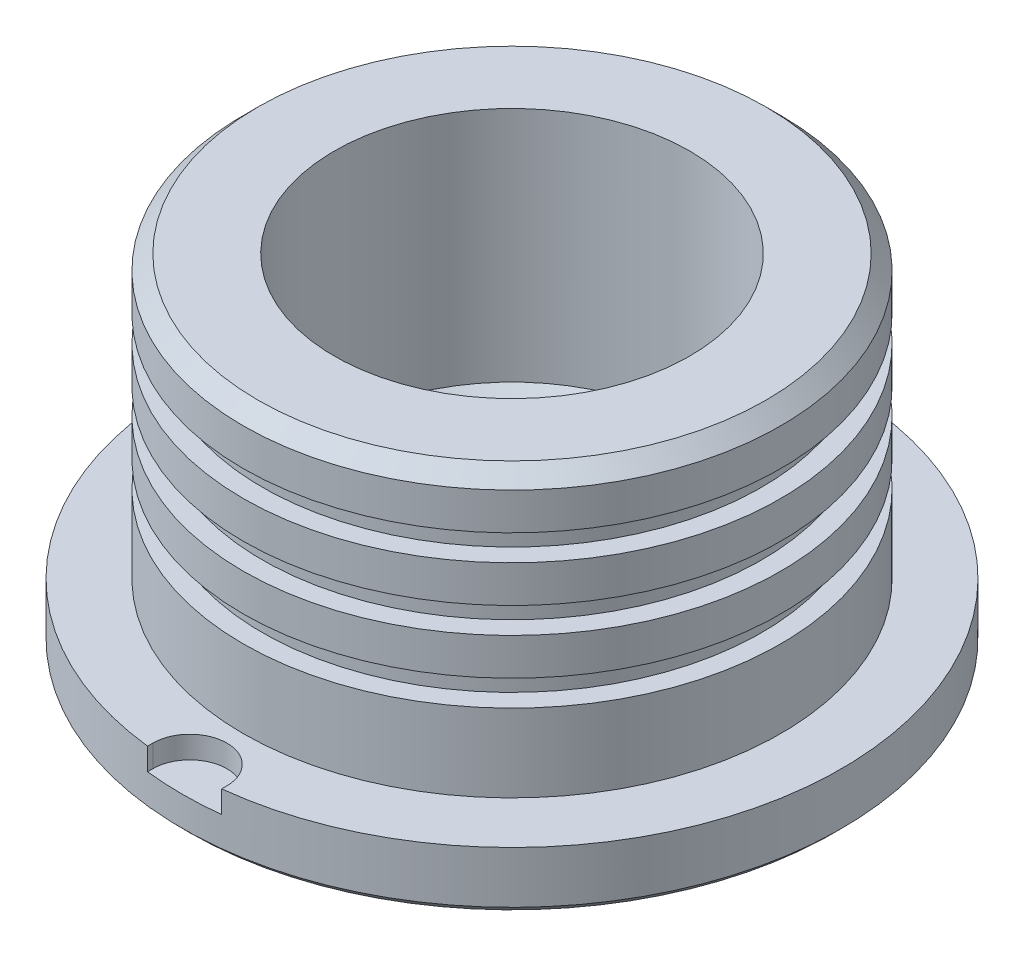
ISO-10303-21;
HEADER;
FILE_DESCRIPTION(('STEP AP214'),'2;1');
FILE_NAME('part.step','',(''),(''),'','','');
FILE_SCHEMA(('AUTOMOTIVE_DESIGN { 1 0 10303 214 1 1 1 1 }'));
ENDSEC;
DATA;
#1=APPLICATION_CONTEXT('core data for automotive mechanical design processes');
#2=APPLICATION_PROTOCOL_DEFINITION('international standard','automotive_design',2000,#1);
#3=PRODUCT_CONTEXT('',#1,'mechanical');
#4=PRODUCT('Part','Part','',(#3));
#5=PRODUCT_RELATED_PRODUCT_CATEGORY('part','',(#4));
#6=PRODUCT_DEFINITION_FORMATION('','',#4);
#7=PRODUCT_DEFINITION_CONTEXT('part definition',#1,'design');
#8=PRODUCT_DEFINITION('design','',#6,#7);
#9=PRODUCT_DEFINITION_SHAPE('','',#8);
#10=(LENGTH_UNIT() NAMED_UNIT(*) SI_UNIT(.MILLI.,.METRE.));
#11=(NAMED_UNIT(*) PLANE_ANGLE_UNIT() SI_UNIT($,.RADIAN.));
#12=(NAMED_UNIT(*) SI_UNIT($,.STERADIAN.) SOLID_ANGLE_UNIT());
#13=UNCERTAINTY_MEASURE_WITH_UNIT(LENGTH_MEASURE(1.E-05),#10,'distance_accuracy_value','');
#14=(GEOMETRIC_REPRESENTATION_CONTEXT(3) GLOBAL_UNCERTAINTY_ASSIGNED_CONTEXT((#13)) GLOBAL_UNIT_ASSIGNED_CONTEXT((#10,
#11,#12)) REPRESENTATION_CONTEXT('',''));
#15=CARTESIAN_POINT('',(0.,0.,0.));
#16=DIRECTION('',(0.,0.,1.));
#17=DIRECTION('',(1.,0.,0.));
#18=AXIS2_PLACEMENT_3D('',#15,#16,#17);
#19=CARTESIAN_POINT('',(24.,12.0000000000002,0.));
#20=DIRECTION('',(0.,1.,0.));
#21=DIRECTION('',(0.,0.,1.));
#22=AXIS2_PLACEMENT_3D('',#19,#20,#21);
#23=PLANE('',#22);
#24=CARTESIAN_POINT('',(0.,12.0000000000002,0.));
#25=DIRECTION('',(0.,1.,0.));
#26=DIRECTION('',(0.,0.,1.));
#27=AXIS2_PLACEMENT_3D('',#24,#25,#26);
#28=CIRCLE('',#27,22.);
#29=CARTESIAN_POINT('',(0.,12.0000000000002,22.));
#30=VERTEX_POINT('',#29);
#31=EDGE_CURVE('E226',#30,#30,#28,.T.);
#32=ORIENTED_EDGE('',*,*,#31,.T.);
#33=EDGE_LOOP('',(#32));
#34=FACE_BOUND('',#33,.T.);
#35=CARTESIAN_POINT('',(-9.94112549695428,12.0000000000002,9.94112549695428));
#36=DIRECTION('',(0.,1.,0.));
#37=DIRECTION('',(0.,0.,1.));
#38=AXIS2_PLACEMENT_3D('',#35,#36,#37);
#39=CIRCLE('',#38,5.);
#40=CARTESIAN_POINT('',(-9.94112549695428,12.0000000000002,14.9411254969543));
#41=VERTEX_POINT('',#40);
#42=EDGE_CURVE('E417',#41,#41,#39,.F.);
#43=ORIENTED_EDGE('',*,*,#42,.T.);
#44=EDGE_LOOP('',(#43));
#45=FACE_BOUND('',#44,.T.);
#46=CARTESIAN_POINT('',(9.94112549695428,12.0000000000002,9.94112549695428));
#47=DIRECTION('',(0.,1.,0.));
#48=DIRECTION('',(0.,0.,1.));
#49=AXIS2_PLACEMENT_3D('',#46,#47,#48);
#50=CIRCLE('',#49,5.);
#51=CARTESIAN_POINT('',(9.94112549695428,12.0000000000002,14.9411254969543));
#52=VERTEX_POINT('',#51);
#53=EDGE_CURVE('E414',#52,#52,#50,.T.);
#54=ORIENTED_EDGE('',*,*,#53,.F.);
#55=EDGE_LOOP('',(#54));
#56=FACE_BOUND('',#55,.T.);
#57=CARTESIAN_POINT('',(-9.94112549695428,12.0000000000002,-9.94112549695428));
#58=DIRECTION('',(0.,1.,0.));
#59=DIRECTION('',(0.,0.,1.));
#60=AXIS2_PLACEMENT_3D('',#57,#58,#59);
#61=CIRCLE('',#60,5.);
#62=CARTESIAN_POINT('',(-9.94112549695428,12.0000000000002,-4.94112549695428));
#63=VERTEX_POINT('',#62);
#64=EDGE_CURVE('E134',#63,#63,#61,.T.);
#65=ORIENTED_EDGE('',*,*,#64,.F.);
#66=EDGE_LOOP('',(#65));
#67=FACE_BOUND('',#66,.T.);
#68=CARTESIAN_POINT('',(9.94112549695428,12.0000000000002,-9.94112549695428));
#69=DIRECTION('',(0.,1.,0.));
#70=DIRECTION('',(0.,0.,1.));
#71=AXIS2_PLACEMENT_3D('',#68,#69,#70);
#72=CIRCLE('',#71,5.);
#73=CARTESIAN_POINT('',(9.94112549695428,12.0000000000002,-4.94112549695428));
#74=VERTEX_POINT('',#73);
#75=EDGE_CURVE('E423',#74,#74,#72,.F.);
#76=ORIENTED_EDGE('',*,*,#75,.T.);
#77=EDGE_LOOP('',(#76));
#78=FACE_BOUND('',#77,.T.);
#79=ADVANCED_FACE('F43',(#34,#45,#56,#67,#78),#23,.T.);
#80=CARTESIAN_POINT('',(0.,0.,0.));
#81=DIRECTION('',(0.,-1.,0.));
#82=DIRECTION('',(0.,0.,-1.));
#83=AXIS2_PLACEMENT_3D('',#80,#81,#82);
#84=PLANE('',#83);
#85=CARTESIAN_POINT('',(0.,0.,0.));
#86=DIRECTION('',(0.,-1.,0.));
#87=DIRECTION('',(0.,0.,-1.));
#88=AXIS2_PLACEMENT_3D('',#85,#86,#87);
#89=CIRCLE('',#88,43.5);
#90=CARTESIAN_POINT('',(0.,0.,-43.5));
#91=VERTEX_POINT('',#90);
#92=EDGE_CURVE('E52',#91,#91,#89,.T.);
#93=ORIENTED_EDGE('',*,*,#92,.T.);
#94=EDGE_LOOP('',(#93));
#95=FACE_BOUND('',#94,.T.);
#96=CARTESIAN_POINT('',(-9.94112549695428,0.,9.94112549695428));
#97=DIRECTION('',(0.,1.,0.));
#98=DIRECTION('',(0.,0.,1.));
#99=AXIS2_PLACEMENT_3D('',#96,#97,#98);
#100=CIRCLE('',#99,5.);
#101=CARTESIAN_POINT('',(-9.94112549695428,0.,14.9411254969543));
#102=VERTEX_POINT('',#101);
#103=EDGE_CURVE('E426',#102,#102,#100,.F.);
#104=ORIENTED_EDGE('',*,*,#103,.F.);
#105=EDGE_LOOP('',(#104));
#106=FACE_BOUND('',#105,.T.);
#107=CARTESIAN_POINT('',(9.94112549695428,0.,9.94112549695428));
#108=DIRECTION('',(0.,1.,0.));
#109=DIRECTION('',(0.,0.,1.));
#110=AXIS2_PLACEMENT_3D('',#107,#108,#109);
#111=CIRCLE('',#110,5.);
#112=CARTESIAN_POINT('',(9.94112549695428,0.,14.9411254969543));
#113=VERTEX_POINT('',#112);
#114=EDGE_CURVE('E411',#113,#113,#111,.T.);
#115=ORIENTED_EDGE('',*,*,#114,.T.);
#116=EDGE_LOOP('',(#115));
#117=FACE_BOUND('',#116,.T.);
#118=CARTESIAN_POINT('',(-9.94112549695428,0.,-9.94112549695428));
#119=DIRECTION('',(0.,1.,0.));
#120=DIRECTION('',(0.,0.,1.));
#121=AXIS2_PLACEMENT_3D('',#118,#119,#120);
#122=CIRCLE('',#121,5.);
#123=CARTESIAN_POINT('',(-9.94112549695428,0.,-4.94112549695428));
#124=VERTEX_POINT('',#123);
#125=EDGE_CURVE('E153',#124,#124,#122,.T.);
#126=ORIENTED_EDGE('',*,*,#125,.T.);
#127=EDGE_LOOP('',(#126));
#128=FACE_BOUND('',#127,.T.);
#129=CARTESIAN_POINT('',(9.94112549695428,0.,-9.94112549695428));
#130=DIRECTION('',(0.,1.,0.));
#131=DIRECTION('',(0.,0.,1.));
#132=AXIS2_PLACEMENT_3D('',#129,#130,#131);
#133=CIRCLE('',#132,5.);
#134=CARTESIAN_POINT('',(9.94112549695428,0.,-4.94112549695428));
#135=VERTEX_POINT('',#134);
#136=EDGE_CURVE('E420',#135,#135,#133,.F.);
#137=ORIENTED_EDGE('',*,*,#136,.F.);
#138=EDGE_LOOP('',(#137));
#139=FACE_BOUND('',#138,.T.);
#140=ADVANCED_FACE('F231',(#95,#106,#117,#128,#139),#84,.T.);
#141=CARTESIAN_POINT('',(0.,0.,0.));
#142=DIRECTION('',(0.,-1.,0.));
#143=DIRECTION('',(0.,0.,-1.));
#144=AXIS2_PLACEMENT_3D('',#141,#142,#143);
#145=CYLINDRICAL_SURFACE('',#144,36.3);
#146=CARTESIAN_POINT('',(0.,44.,0.));
#147=DIRECTION('',(0.,1.,0.));
#148=DIRECTION('',(0.,0.,1.));
#149=AXIS2_PLACEMENT_3D('',#146,#147,#148);
#150=CIRCLE('',#149,36.3);
#151=CARTESIAN_POINT('',(0.,44.,36.3));
#152=VERTEX_POINT('',#151);
#153=EDGE_CURVE('E217',#152,#152,#150,.F.);
#154=ORIENTED_EDGE('',*,*,#153,.T.);
#155=EDGE_LOOP('',(#154));
#156=FACE_BOUND('',#155,.T.);
#157=CARTESIAN_POINT('',(0.,39.,0.));
#158=DIRECTION('',(0.,-1.,0.));
#159=DIRECTION('',(0.,0.,-1.));
#160=AXIS2_PLACEMENT_3D('',#157,#158,#159);
#161=CIRCLE('',#160,36.3);
#162=CARTESIAN_POINT('',(0.,39.,-36.3));
#163=VERTEX_POINT('',#162);
#164=EDGE_CURVE('E163',#163,#163,#161,.T.);
#165=ORIENTED_EDGE('',*,*,#164,.F.);
#166=EDGE_LOOP('',(#165));
#167=FACE_BOUND('',#166,.T.);
#168=ADVANCED_FACE('F249',(#156,#167),#145,.T.);
#169=CARTESIAN_POINT('',(36.3,46.,0.));
#170=DIRECTION('',(0.,1.,0.));
#171=DIRECTION('',(0.,0.,1.));
#172=AXIS2_PLACEMENT_3D('',#169,#170,#171);
#173=PLANE('',#172);
#174=CARTESIAN_POINT('',(0.,46.,0.));
#175=DIRECTION('',(0.,1.,0.));
#176=DIRECTION('',(0.,0.,1.));
#177=AXIS2_PLACEMENT_3D('',#174,#175,#176);
#178=CIRCLE('',#177,34.2999999999999);
#179=CARTESIAN_POINT('',(0.,46.,34.2999999999999));
#180=VERTEX_POINT('',#179);
#181=EDGE_CURVE('E220',#180,#180,#178,.T.);
#182=ORIENTED_EDGE('',*,*,#181,.T.);
#183=EDGE_LOOP('',(#182));
#184=FACE_BOUND('',#183,.T.);
#185=CARTESIAN_POINT('',(0.,46.,0.));
#186=DIRECTION('',(0.,-1.,0.));
#187=DIRECTION('',(0.,0.,-1.));
#188=AXIS2_PLACEMENT_3D('',#185,#186,#187);
#189=CIRCLE('',#188,24.);
#190=CARTESIAN_POINT('',(0.,46.,-24.));
#191=VERTEX_POINT('',#190);
#192=EDGE_CURVE('E206',#191,#191,#189,.T.);
#193=ORIENTED_EDGE('',*,*,#192,.T.);
#194=EDGE_LOOP('',(#193));
#195=FACE_BOUND('',#194,.T.);
#196=ADVANCED_FACE('F258',(#184,#195),#173,.T.);
#197=CARTESIAN_POINT('',(0.,0.,0.));
#198=DIRECTION('',(0.,-1.,0.));
#199=DIRECTION('',(0.,0.,-1.));
#200=AXIS2_PLACEMENT_3D('',#197,#198,#199);
#201=CYLINDRICAL_SURFACE('',#200,24.);
#202=CARTESIAN_POINT('',(0.,14.0000000000003,0.));
#203=DIRECTION('',(0.,1.,0.));
#204=DIRECTION('',(0.,0.,1.));
#205=AXIS2_PLACEMENT_3D('',#202,#203,#204);
#206=CIRCLE('',#205,24.);
#207=CARTESIAN_POINT('',(0.,14.0000000000003,24.));
#208=VERTEX_POINT('',#207);
#209=EDGE_CURVE('E223',#208,#208,#206,.F.);
#210=ORIENTED_EDGE('',*,*,#209,.T.);
#211=EDGE_LOOP('',(#210));
#212=FACE_BOUND('',#211,.T.);
#213=ORIENTED_EDGE('',*,*,#192,.F.);
#214=EDGE_LOOP('',(#213));
#215=FACE_BOUND('',#214,.T.);
#216=ADVANCED_FACE('F254',(#212,#215),#201,.F.);
#217=CARTESIAN_POINT('',(0.,0.,0.));
#218=DIRECTION('',(0.,-1.,0.));
#219=DIRECTION('',(0.,0.,-1.));
#220=AXIS2_PLACEMENT_3D('',#217,#218,#219);
#221=CYLINDRICAL_SURFACE('',#220,44.5);
#222=CARTESIAN_POINT('',(0.,0.99999999999997,0.));
#223=DIRECTION('',(0.,-1.,0.));
#224=DIRECTION('',(0.,0.,-1.));
#225=AXIS2_PLACEMENT_3D('',#222,#223,#224);
#226=CIRCLE('',#225,44.5);
#227=CARTESIAN_POINT('',(0.,0.99999999999997,-44.5));
#228=VERTEX_POINT('',#227);
#229=EDGE_CURVE('E11',#228,#228,#226,.F.);
#230=ORIENTED_EDGE('',*,*,#229,.T.);
#231=EDGE_LOOP('',(#230));
#232=FACE_BOUND('',#231,.T.);
#233=DIRECTION('',(0.,-1.,0.));
#234=VECTOR('',#233,1.);
#235=CARTESIAN_POINT('',(-5.,0.,-44.218208918951));
#236=LINE('',#235,#234);
#237=CARTESIAN_POINT('',(-5.,5.,-44.218208918951));
#238=VERTEX_POINT('',#237);
#239=CARTESIAN_POINT('',(-5.,8.,-44.218208918951));
#240=VERTEX_POINT('',#239);
#241=EDGE_CURVE('E161',#238,#240,#236,.F.);
#242=ORIENTED_EDGE('',*,*,#241,.F.);
#243=CARTESIAN_POINT('',(0.,5.,0.));
#244=DIRECTION('',(0.,1.,0.));
#245=DIRECTION('',(0.,0.,1.));
#246=AXIS2_PLACEMENT_3D('',#243,#244,#245);
#247=CIRCLE('',#246,44.5);
#248=CARTESIAN_POINT('',(5.,5.,-44.218208918951));
#249=VERTEX_POINT('',#248);
#250=EDGE_CURVE('E215',#238,#249,#247,.F.);
#251=ORIENTED_EDGE('',*,*,#250,.T.);
#252=DIRECTION('',(0.,-1.,0.));
#253=VECTOR('',#252,1.);
#254=CARTESIAN_POINT('',(5.,0.,-44.218208918951));
#255=LINE('',#254,#253);
#256=CARTESIAN_POINT('',(5.,8.,-44.218208918951));
#257=VERTEX_POINT('',#256);
#258=EDGE_CURVE('E123',#257,#249,#255,.T.);
#259=ORIENTED_EDGE('',*,*,#258,.F.);
#260=CARTESIAN_POINT('',(0.,8.,0.));
#261=DIRECTION('',(0.,-1.,0.));
#262=DIRECTION('',(0.,0.,-1.));
#263=AXIS2_PLACEMENT_3D('',#260,#261,#262);
#264=CIRCLE('',#263,44.5);
#265=CARTESIAN_POINT('',(5.,8.,44.218208918951));
#266=VERTEX_POINT('',#265);
#267=EDGE_CURVE('E203',#257,#266,#264,.T.);
#268=ORIENTED_EDGE('',*,*,#267,.T.);
#269=DIRECTION('',(0.,-1.,0.));
#270=VECTOR('',#269,1.);
#271=CARTESIAN_POINT('',(5.,0.,44.218208918951));
#272=LINE('',#271,#270);
#273=CARTESIAN_POINT('',(5.,5.,44.218208918951));
#274=VERTEX_POINT('',#273);
#275=EDGE_CURVE('E158',#274,#266,#272,.F.);
#276=ORIENTED_EDGE('',*,*,#275,.F.);
#277=CARTESIAN_POINT('',(0.,5.,0.));
#278=DIRECTION('',(0.,-1.,0.));
#279=DIRECTION('',(0.,0.,-1.));
#280=AXIS2_PLACEMENT_3D('',#277,#278,#279);
#281=CIRCLE('',#280,44.5);
#282=CARTESIAN_POINT('',(-5.,5.,44.218208918951));
#283=VERTEX_POINT('',#282);
#284=EDGE_CURVE('E213',#283,#274,#281,.F.);
#285=ORIENTED_EDGE('',*,*,#284,.F.);
#286=DIRECTION('',(0.,-1.,0.));
#287=VECTOR('',#286,1.);
#288=CARTESIAN_POINT('',(-5.,0.,44.218208918951));
#289=LINE('',#288,#287);
#290=CARTESIAN_POINT('',(-5.,8.,44.218208918951));
#291=VERTEX_POINT('',#290);
#292=EDGE_CURVE('E140',#291,#283,#289,.T.);
#293=ORIENTED_EDGE('',*,*,#292,.F.);
#294=EDGE_CURVE('E202',#291,#240,#264,.T.);
#295=ORIENTED_EDGE('',*,*,#294,.T.);
#296=EDGE_LOOP('',(#242,#251,#259,#268,#276,#285,#293,#295));
#297=FACE_BOUND('',#296,.T.);
#298=ADVANCED_FACE('F257',(#232,#297),#221,.T.);
#299=CARTESIAN_POINT('',(44.5,8.,0.));
#300=DIRECTION('',(0.,1.,0.));
#301=DIRECTION('',(0.,0.,1.));
#302=AXIS2_PLACEMENT_3D('',#299,#300,#301);
#303=PLANE('',#302);
#304=DIRECTION('',(0.,0.,1.));
#305=VECTOR('',#304,1.);
#306=CARTESIAN_POINT('',(-5.,8.,0.));
#307=LINE('',#306,#305);
#308=CARTESIAN_POINT('',(-5.,8.,-43.5));
#309=VERTEX_POINT('',#308);
#310=EDGE_CURVE('E211',#240,#309,#307,.T.);
#311=ORIENTED_EDGE('',*,*,#310,.F.);
#312=ORIENTED_EDGE('',*,*,#294,.F.);
#313=DIRECTION('',(0.,0.,1.));
#314=VECTOR('',#313,1.);
#315=CARTESIAN_POINT('',(-5.,8.,43.5));
#316=LINE('',#315,#314);
#317=CARTESIAN_POINT('',(-5.,8.,43.5));
#318=VERTEX_POINT('',#317);
#319=EDGE_CURVE('E146',#318,#291,#316,.T.);
#320=ORIENTED_EDGE('',*,*,#319,.F.);
#321=CARTESIAN_POINT('',(0.,8.,43.5));
#322=DIRECTION('',(0.,1.,0.));
#323=DIRECTION('',(0.,0.,-1.));
#324=AXIS2_PLACEMENT_3D('',#321,#322,#323);
#325=CIRCLE('',#324,5.);
#326=CARTESIAN_POINT('',(5.,8.,43.5));
#327=VERTEX_POINT('',#326);
#328=EDGE_CURVE('E67',#327,#318,#325,.T.);
#329=ORIENTED_EDGE('',*,*,#328,.F.);
#330=DIRECTION('',(0.,0.,-1.));
#331=VECTOR('',#330,1.);
#332=CARTESIAN_POINT('',(5.,8.,0.));
#333=LINE('',#332,#331);
#334=EDGE_CURVE('E209',#266,#327,#333,.T.);
#335=ORIENTED_EDGE('',*,*,#334,.F.);
#336=ORIENTED_EDGE('',*,*,#267,.F.);
#337=DIRECTION('',(0.,0.,-1.));
#338=VECTOR('',#337,1.);
#339=CARTESIAN_POINT('',(5.,8.,-43.5));
#340=LINE('',#339,#338);
#341=CARTESIAN_POINT('',(5.,8.,-43.5));
#342=VERTEX_POINT('',#341);
#343=EDGE_CURVE('E130',#342,#257,#340,.T.);
#344=ORIENTED_EDGE('',*,*,#343,.F.);
#345=CARTESIAN_POINT('',(0.,8.,-43.5));
#346=DIRECTION('',(0.,1.,0.));
#347=DIRECTION('',(0.,0.,1.));
#348=AXIS2_PLACEMENT_3D('',#345,#346,#347);
#349=CIRCLE('',#348,5.);
#350=EDGE_CURVE('E59',#309,#342,#349,.T.);
#351=ORIENTED_EDGE('',*,*,#350,.F.);
#352=EDGE_LOOP('',(#311,#312,#320,#329,#335,#336,#344,#351));
#353=FACE_BOUND('',#352,.T.);
#354=CARTESIAN_POINT('',(0.,8.,0.));
#355=DIRECTION('',(0.,-1.,0.));
#356=DIRECTION('',(0.,0.,-1.));
#357=AXIS2_PLACEMENT_3D('',#354,#355,#356);
#358=CIRCLE('',#357,36.3);
#359=CARTESIAN_POINT('',(0.,8.,-36.3));
#360=VERTEX_POINT('',#359);
#361=EDGE_CURVE('E199',#360,#360,#358,.T.);
#362=ORIENTED_EDGE('',*,*,#361,.T.);
#363=EDGE_LOOP('',(#362));
#364=FACE_BOUND('',#363,.T.);
#365=ADVANCED_FACE('F359',(#353,#364),#303,.T.);
#366=CARTESIAN_POINT('',(0.,0.,0.));
#367=DIRECTION('',(0.,-1.,0.));
#368=DIRECTION('',(0.,0.,-1.));
#369=AXIS2_PLACEMENT_3D('',#366,#367,#368);
#370=CYLINDRICAL_SURFACE('',#369,36.3);
#371=CARTESIAN_POINT('',(0.,18.5,0.));
#372=DIRECTION('',(0.,-1.,0.));
#373=DIRECTION('',(0.,0.,-1.));
#374=AXIS2_PLACEMENT_3D('',#371,#372,#373);
#375=CIRCLE('',#374,36.3);
#376=CARTESIAN_POINT('',(0.,18.5,-36.3));
#377=VERTEX_POINT('',#376);
#378=EDGE_CURVE('E196',#377,#377,#375,.T.);
#379=ORIENTED_EDGE('',*,*,#378,.T.);
#380=EDGE_LOOP('',(#379));
#381=FACE_BOUND('',#380,.T.);
#382=ORIENTED_EDGE('',*,*,#361,.F.);
#383=EDGE_LOOP('',(#382));
#384=FACE_BOUND('',#383,.T.);
#385=ADVANCED_FACE('F353',(#381,#384),#370,.T.);
#386=CARTESIAN_POINT('',(36.3,18.5,0.));
#387=DIRECTION('',(0.,1.,0.));
#388=DIRECTION('',(0.,0.,1.));
#389=AXIS2_PLACEMENT_3D('',#386,#387,#388);
#390=PLANE('',#389);
#391=CARTESIAN_POINT('',(0.,18.5,0.));
#392=DIRECTION('',(0.,-1.,0.));
#393=DIRECTION('',(0.,0.,-1.));
#394=AXIS2_PLACEMENT_3D('',#391,#392,#393);
#395=CIRCLE('',#394,33.7);
#396=CARTESIAN_POINT('',(0.,18.5,-33.7));
#397=VERTEX_POINT('',#396);
#398=EDGE_CURVE('E193',#397,#397,#395,.T.);
#399=ORIENTED_EDGE('',*,*,#398,.T.);
#400=EDGE_LOOP('',(#399));
#401=FACE_BOUND('',#400,.T.);
#402=ORIENTED_EDGE('',*,*,#378,.F.);
#403=EDGE_LOOP('',(#402));
#404=FACE_BOUND('',#403,.T.);
#405=ADVANCED_FACE('F347',(#401,#404),#390,.T.);
#406=CARTESIAN_POINT('',(0.,0.,0.));
#407=DIRECTION('',(0.,-1.,0.));
#408=DIRECTION('',(0.,0.,-1.));
#409=AXIS2_PLACEMENT_3D('',#406,#407,#408);
#410=CYLINDRICAL_SURFACE('',#409,33.7);
#411=CARTESIAN_POINT('',(0.,22.,0.));
#412=DIRECTION('',(0.,-1.,0.));
#413=DIRECTION('',(0.,0.,-1.));
#414=AXIS2_PLACEMENT_3D('',#411,#412,#413);
#415=CIRCLE('',#414,33.7);
#416=CARTESIAN_POINT('',(0.,22.,-33.7));
#417=VERTEX_POINT('',#416);
#418=EDGE_CURVE('E190',#417,#417,#415,.T.);
#419=ORIENTED_EDGE('',*,*,#418,.T.);
#420=EDGE_LOOP('',(#419));
#421=FACE_BOUND('',#420,.T.);
#422=ORIENTED_EDGE('',*,*,#398,.F.);
#423=EDGE_LOOP('',(#422));
#424=FACE_BOUND('',#423,.T.);
#425=ADVANCED_FACE('F341',(#421,#424),#410,.T.);
#426=CARTESIAN_POINT('',(33.7,22.,0.));
#427=DIRECTION('',(0.,-1.,0.));
#428=DIRECTION('',(0.,0.,-1.));
#429=AXIS2_PLACEMENT_3D('',#426,#427,#428);
#430=PLANE('',#429);
#431=CARTESIAN_POINT('',(0.,22.,0.));
#432=DIRECTION('',(0.,-1.,0.));
#433=DIRECTION('',(0.,0.,-1.));
#434=AXIS2_PLACEMENT_3D('',#431,#432,#433);
#435=CIRCLE('',#434,36.3);
#436=CARTESIAN_POINT('',(0.,22.,-36.3));
#437=VERTEX_POINT('',#436);
#438=EDGE_CURVE('E187',#437,#437,#435,.T.);
#439=ORIENTED_EDGE('',*,*,#438,.T.);
#440=EDGE_LOOP('',(#439));
#441=FACE_BOUND('',#440,.T.);
#442=ORIENTED_EDGE('',*,*,#418,.F.);
#443=EDGE_LOOP('',(#442));
#444=FACE_BOUND('',#443,.T.);
#445=ADVANCED_FACE('F335',(#441,#444),#430,.T.);
#446=CARTESIAN_POINT('',(0.,0.,0.));
#447=DIRECTION('',(0.,-1.,0.));
#448=DIRECTION('',(0.,0.,-1.));
#449=AXIS2_PLACEMENT_3D('',#446,#447,#448);
#450=CYLINDRICAL_SURFACE('',#449,36.3);
#451=CARTESIAN_POINT('',(0.,27.,0.));
#452=DIRECTION('',(0.,-1.,0.));
#453=DIRECTION('',(0.,0.,-1.));
#454=AXIS2_PLACEMENT_3D('',#451,#452,#453);
#455=CIRCLE('',#454,36.3);
#456=CARTESIAN_POINT('',(0.,27.,-36.3));
#457=VERTEX_POINT('',#456);
#458=EDGE_CURVE('E184',#457,#457,#455,.T.);
#459=ORIENTED_EDGE('',*,*,#458,.T.);
#460=EDGE_LOOP('',(#459));
#461=FACE_BOUND('',#460,.T.);
#462=ORIENTED_EDGE('',*,*,#438,.F.);
#463=EDGE_LOOP('',(#462));
#464=FACE_BOUND('',#463,.T.);
#465=ADVANCED_FACE('F329',(#461,#464),#450,.T.);
#466=CARTESIAN_POINT('',(36.3,27.,0.));
#467=DIRECTION('',(0.,1.,0.));
#468=DIRECTION('',(0.,0.,1.));
#469=AXIS2_PLACEMENT_3D('',#466,#467,#468);
#470=PLANE('',#469);
#471=CARTESIAN_POINT('',(0.,27.,0.));
#472=DIRECTION('',(0.,-1.,0.));
#473=DIRECTION('',(0.,0.,-1.));
#474=AXIS2_PLACEMENT_3D('',#471,#472,#473);
#475=CIRCLE('',#474,33.7);
#476=CARTESIAN_POINT('',(0.,27.,-33.7));
#477=VERTEX_POINT('',#476);
#478=EDGE_CURVE('E181',#477,#477,#475,.T.);
#479=ORIENTED_EDGE('',*,*,#478,.T.);
#480=EDGE_LOOP('',(#479));
#481=FACE_BOUND('',#480,.T.);
#482=ORIENTED_EDGE('',*,*,#458,.F.);
#483=EDGE_LOOP('',(#482));
#484=FACE_BOUND('',#483,.T.);
#485=ADVANCED_FACE('F323',(#481,#484),#470,.T.);
#486=CARTESIAN_POINT('',(0.,0.,0.));
#487=DIRECTION('',(0.,-1.,0.));
#488=DIRECTION('',(0.,0.,-1.));
#489=AXIS2_PLACEMENT_3D('',#486,#487,#488);
#490=CYLINDRICAL_SURFACE('',#489,33.7);
#491=CARTESIAN_POINT('',(0.,30.5,0.));
#492=DIRECTION('',(0.,-1.,0.));
#493=DIRECTION('',(0.,0.,-1.));
#494=AXIS2_PLACEMENT_3D('',#491,#492,#493);
#495=CIRCLE('',#494,33.7);
#496=CARTESIAN_POINT('',(0.,30.5,-33.7));
#497=VERTEX_POINT('',#496);
#498=EDGE_CURVE('E178',#497,#497,#495,.T.);
#499=ORIENTED_EDGE('',*,*,#498,.T.);
#500=EDGE_LOOP('',(#499));
#501=FACE_BOUND('',#500,.T.);
#502=ORIENTED_EDGE('',*,*,#478,.F.);
#503=EDGE_LOOP('',(#502));
#504=FACE_BOUND('',#503,.T.);
#505=ADVANCED_FACE('F317',(#501,#504),#490,.T.);
#506=CARTESIAN_POINT('',(33.7,30.5,0.));
#507=DIRECTION('',(0.,-1.,0.));
#508=DIRECTION('',(0.,0.,-1.));
#509=AXIS2_PLACEMENT_3D('',#506,#507,#508);
#510=PLANE('',#509);
#511=CARTESIAN_POINT('',(0.,30.5,0.));
#512=DIRECTION('',(0.,-1.,0.));
#513=DIRECTION('',(0.,0.,-1.));
#514=AXIS2_PLACEMENT_3D('',#511,#512,#513);
#515=CIRCLE('',#514,36.3);
#516=CARTESIAN_POINT('',(0.,30.5,-36.3));
#517=VERTEX_POINT('',#516);
#518=EDGE_CURVE('E175',#517,#517,#515,.T.);
#519=ORIENTED_EDGE('',*,*,#518,.T.);
#520=EDGE_LOOP('',(#519));
#521=FACE_BOUND('',#520,.T.);
#522=ORIENTED_EDGE('',*,*,#498,.F.);
#523=EDGE_LOOP('',(#522));
#524=FACE_BOUND('',#523,.T.);
#525=ADVANCED_FACE('F311',(#521,#524),#510,.T.);
#526=CARTESIAN_POINT('',(0.,0.,0.));
#527=DIRECTION('',(0.,-1.,0.));
#528=DIRECTION('',(0.,0.,-1.));
#529=AXIS2_PLACEMENT_3D('',#526,#527,#528);
#530=CYLINDRICAL_SURFACE('',#529,36.3);
#531=CARTESIAN_POINT('',(0.,35.5,0.));
#532=DIRECTION('',(0.,-1.,0.));
#533=DIRECTION('',(0.,0.,-1.));
#534=AXIS2_PLACEMENT_3D('',#531,#532,#533);
#535=CIRCLE('',#534,36.3);
#536=CARTESIAN_POINT('',(0.,35.5,-36.3));
#537=VERTEX_POINT('',#536);
#538=EDGE_CURVE('E172',#537,#537,#535,.T.);
#539=ORIENTED_EDGE('',*,*,#538,.T.);
#540=EDGE_LOOP('',(#539));
#541=FACE_BOUND('',#540,.T.);
#542=ORIENTED_EDGE('',*,*,#518,.F.);
#543=EDGE_LOOP('',(#542));
#544=FACE_BOUND('',#543,.T.);
#545=ADVANCED_FACE('F305',(#541,#544),#530,.T.);
#546=CARTESIAN_POINT('',(36.3,35.5,0.));
#547=DIRECTION('',(0.,1.,0.));
#548=DIRECTION('',(0.,0.,1.));
#549=AXIS2_PLACEMENT_3D('',#546,#547,#548);
#550=PLANE('',#549);
#551=CARTESIAN_POINT('',(0.,35.5,0.));
#552=DIRECTION('',(0.,-1.,0.));
#553=DIRECTION('',(0.,0.,-1.));
#554=AXIS2_PLACEMENT_3D('',#551,#552,#553);
#555=CIRCLE('',#554,33.6999999999999);
#556=CARTESIAN_POINT('',(0.,35.5,-33.6999999999999));
#557=VERTEX_POINT('',#556);
#558=EDGE_CURVE('E169',#557,#557,#555,.T.);
#559=ORIENTED_EDGE('',*,*,#558,.T.);
#560=EDGE_LOOP('',(#559));
#561=FACE_BOUND('',#560,.T.);
#562=ORIENTED_EDGE('',*,*,#538,.F.);
#563=EDGE_LOOP('',(#562));
#564=FACE_BOUND('',#563,.T.);
#565=ADVANCED_FACE('F299',(#561,#564),#550,.T.);
#566=CARTESIAN_POINT('',(0.,0.,0.));
#567=DIRECTION('',(0.,-1.,0.));
#568=DIRECTION('',(0.,0.,-1.));
#569=AXIS2_PLACEMENT_3D('',#566,#567,#568);
#570=CYLINDRICAL_SURFACE('',#569,33.6999999999999);
#571=CARTESIAN_POINT('',(0.,39.,0.));
#572=DIRECTION('',(0.,-1.,0.));
#573=DIRECTION('',(0.,0.,-1.));
#574=AXIS2_PLACEMENT_3D('',#571,#572,#573);
#575=CIRCLE('',#574,33.6999999999999);
#576=CARTESIAN_POINT('',(0.,39.,-33.6999999999999));
#577=VERTEX_POINT('',#576);
#578=EDGE_CURVE('E166',#577,#577,#575,.T.);
#579=ORIENTED_EDGE('',*,*,#578,.T.);
#580=EDGE_LOOP('',(#579));
#581=FACE_BOUND('',#580,.T.);
#582=ORIENTED_EDGE('',*,*,#558,.F.);
#583=EDGE_LOOP('',(#582));
#584=FACE_BOUND('',#583,.T.);
#585=ADVANCED_FACE('F293',(#581,#584),#570,.T.);
#586=CARTESIAN_POINT('',(33.6999999999999,39.,0.));
#587=DIRECTION('',(0.,-1.,0.));
#588=DIRECTION('',(0.,0.,-1.));
#589=AXIS2_PLACEMENT_3D('',#586,#587,#588);
#590=PLANE('',#589);
#591=ORIENTED_EDGE('',*,*,#164,.T.);
#592=EDGE_LOOP('',(#591));
#593=FACE_BOUND('',#592,.T.);
#594=ORIENTED_EDGE('',*,*,#578,.F.);
#595=EDGE_LOOP('',(#594));
#596=FACE_BOUND('',#595,.T.);
#597=ADVANCED_FACE('F289',(#593,#596),#590,.T.);
#598=CARTESIAN_POINT('',(0.,5.,43.5));
#599=DIRECTION('',(0.,1.,0.));
#600=DIRECTION('',(0.,0.,1.));
#601=AXIS2_PLACEMENT_3D('',#598,#599,#600);
#602=CYLINDRICAL_SURFACE('',#601,5.);
#603=ORIENTED_EDGE('',*,*,#328,.T.);
#604=DIRECTION('',(0.,1.,0.));
#605=VECTOR('',#604,1.);
#606=CARTESIAN_POINT('',(-5.,5.,43.5));
#607=LINE('',#606,#605);
#608=CARTESIAN_POINT('',(-5.,5.,43.5));
#609=VERTEX_POINT('',#608);
#610=EDGE_CURVE('E151',#609,#318,#607,.T.);
#611=ORIENTED_EDGE('',*,*,#610,.F.);
#612=CARTESIAN_POINT('',(0.,5.,43.5));
#613=DIRECTION('',(0.,1.,0.));
#614=DIRECTION('',(0.,0.,-1.));
#615=AXIS2_PLACEMENT_3D('',#612,#613,#614);
#616=CIRCLE('',#615,5.);
#617=CARTESIAN_POINT('',(5.,5.,43.5));
#618=VERTEX_POINT('',#617);
#619=EDGE_CURVE('E142',#618,#609,#616,.T.);
#620=ORIENTED_EDGE('',*,*,#619,.F.);
#621=DIRECTION('',(0.,1.,0.));
#622=VECTOR('',#621,1.);
#623=CARTESIAN_POINT('',(5.,5.,43.5));
#624=LINE('',#623,#622);
#625=EDGE_CURVE('E138',#618,#327,#624,.T.);
#626=ORIENTED_EDGE('',*,*,#625,.T.);
#627=EDGE_LOOP('',(#603,#611,#620,#626));
#628=FACE_BOUND('',#627,.T.);
#629=ADVANCED_FACE('F292',(#628),#602,.F.);
#630=CARTESIAN_POINT('',(5.,5.,43.5));
#631=DIRECTION('',(1.,0.,0.));
#632=DIRECTION('',(0.,0.,-1.));
#633=AXIS2_PLACEMENT_3D('',#630,#631,#632);
#634=PLANE('',#633);
#635=ORIENTED_EDGE('',*,*,#275,.T.);
#636=ORIENTED_EDGE('',*,*,#334,.T.);
#637=ORIENTED_EDGE('',*,*,#625,.F.);
#638=DIRECTION('',(0.,0.,-1.));
#639=VECTOR('',#638,1.);
#640=CARTESIAN_POINT('',(5.,5.,43.5));
#641=LINE('',#640,#639);
#642=EDGE_CURVE('E149',#274,#618,#641,.T.);
#643=ORIENTED_EDGE('',*,*,#642,.F.);
#644=EDGE_LOOP('',(#635,#636,#637,#643));
#645=FACE_BOUND('',#644,.T.);
#646=ADVANCED_FACE('F374',(#645),#634,.F.);
#647=CARTESIAN_POINT('',(-5.,5.,43.5));
#648=DIRECTION('',(-1.,0.,0.));
#649=DIRECTION('',(0.,0.,1.));
#650=AXIS2_PLACEMENT_3D('',#647,#648,#649);
#651=PLANE('',#650);
#652=ORIENTED_EDGE('',*,*,#292,.T.);
#653=DIRECTION('',(0.,0.,1.));
#654=VECTOR('',#653,1.);
#655=CARTESIAN_POINT('',(-5.,5.,43.5));
#656=LINE('',#655,#654);
#657=EDGE_CURVE('E145',#609,#283,#656,.T.);
#658=ORIENTED_EDGE('',*,*,#657,.F.);
#659=ORIENTED_EDGE('',*,*,#610,.T.);
#660=ORIENTED_EDGE('',*,*,#319,.T.);
#661=EDGE_LOOP('',(#652,#658,#659,#660));
#662=FACE_BOUND('',#661,.T.);
#663=ADVANCED_FACE('F375',(#662),#651,.F.);
#664=CARTESIAN_POINT('',(0.,5.,43.5));
#665=DIRECTION('',(0.,-1.,0.));
#666=DIRECTION('',(0.,0.,-1.));
#667=AXIS2_PLACEMENT_3D('',#664,#665,#666);
#668=PLANE('',#667);
#669=ORIENTED_EDGE('',*,*,#284,.T.);
#670=ORIENTED_EDGE('',*,*,#642,.T.);
#671=ORIENTED_EDGE('',*,*,#619,.T.);
#672=ORIENTED_EDGE('',*,*,#657,.T.);
#673=EDGE_LOOP('',(#669,#670,#671,#672));
#674=FACE_BOUND('',#673,.T.);
#675=ADVANCED_FACE('F378',(#674),#668,.F.);
#676=CARTESIAN_POINT('',(0.,5.,-43.5));
#677=DIRECTION('',(0.,1.,0.));
#678=DIRECTION('',(0.,0.,1.));
#679=AXIS2_PLACEMENT_3D('',#676,#677,#678);
#680=CYLINDRICAL_SURFACE('',#679,5.);
#681=ORIENTED_EDGE('',*,*,#350,.T.);
#682=DIRECTION('',(0.,1.,0.));
#683=VECTOR('',#682,1.);
#684=CARTESIAN_POINT('',(5.,5.,-43.5));
#685=LINE('',#684,#683);
#686=CARTESIAN_POINT('',(5.,5.,-43.5));
#687=VERTEX_POINT('',#686);
#688=EDGE_CURVE('E109',#687,#342,#685,.T.);
#689=ORIENTED_EDGE('',*,*,#688,.F.);
#690=CARTESIAN_POINT('',(0.,5.,-43.5));
#691=DIRECTION('',(0.,1.,0.));
#692=DIRECTION('',(0.,0.,1.));
#693=AXIS2_PLACEMENT_3D('',#690,#691,#692);
#694=CIRCLE('',#693,5.);
#695=CARTESIAN_POINT('',(-5.,5.,-43.5));
#696=VERTEX_POINT('',#695);
#697=EDGE_CURVE('E113',#696,#687,#694,.T.);
#698=ORIENTED_EDGE('',*,*,#697,.F.);
#699=DIRECTION('',(0.,1.,0.));
#700=VECTOR('',#699,1.);
#701=CARTESIAN_POINT('',(-5.,5.,-43.5));
#702=LINE('',#701,#700);
#703=EDGE_CURVE('E116',#696,#309,#702,.T.);
#704=ORIENTED_EDGE('',*,*,#703,.T.);
#705=EDGE_LOOP('',(#681,#689,#698,#704));
#706=FACE_BOUND('',#705,.T.);
#707=ADVANCED_FACE('F111',(#706),#680,.F.);
#708=CARTESIAN_POINT('',(-5.,5.,-43.5));
#709=DIRECTION('',(-1.,0.,0.));
#710=DIRECTION('',(0.,0.,1.));
#711=AXIS2_PLACEMENT_3D('',#708,#709,#710);
#712=PLANE('',#711);
#713=ORIENTED_EDGE('',*,*,#241,.T.);
#714=ORIENTED_EDGE('',*,*,#310,.T.);
#715=ORIENTED_EDGE('',*,*,#703,.F.);
#716=DIRECTION('',(0.,0.,1.));
#717=VECTOR('',#716,1.);
#718=CARTESIAN_POINT('',(-5.,5.,-43.5));
#719=LINE('',#718,#717);
#720=EDGE_CURVE('E117',#238,#696,#719,.T.);
#721=ORIENTED_EDGE('',*,*,#720,.F.);
#722=EDGE_LOOP('',(#713,#714,#715,#721));
#723=FACE_BOUND('',#722,.T.);
#724=ADVANCED_FACE('F388',(#723),#712,.F.);
#725=CARTESIAN_POINT('',(5.,5.,-43.5));
#726=DIRECTION('',(1.,0.,0.));
#727=DIRECTION('',(0.,0.,-1.));
#728=AXIS2_PLACEMENT_3D('',#725,#726,#727);
#729=PLANE('',#728);
#730=ORIENTED_EDGE('',*,*,#258,.T.);
#731=DIRECTION('',(0.,0.,-1.));
#732=VECTOR('',#731,1.);
#733=CARTESIAN_POINT('',(5.,5.,-43.5));
#734=LINE('',#733,#732);
#735=EDGE_CURVE('E120',#687,#249,#734,.T.);
#736=ORIENTED_EDGE('',*,*,#735,.F.);
#737=ORIENTED_EDGE('',*,*,#688,.T.);
#738=ORIENTED_EDGE('',*,*,#343,.T.);
#739=EDGE_LOOP('',(#730,#736,#737,#738));
#740=FACE_BOUND('',#739,.T.);
#741=ADVANCED_FACE('F121',(#740),#729,.F.);
#742=CARTESIAN_POINT('',(0.,5.,-43.5));
#743=DIRECTION('',(0.,1.,0.));
#744=DIRECTION('',(0.,0.,1.));
#745=AXIS2_PLACEMENT_3D('',#742,#743,#744);
#746=PLANE('',#745);
#747=ORIENTED_EDGE('',*,*,#720,.T.);
#748=ORIENTED_EDGE('',*,*,#697,.T.);
#749=ORIENTED_EDGE('',*,*,#735,.T.);
#750=ORIENTED_EDGE('',*,*,#250,.F.);
#751=EDGE_LOOP('',(#747,#748,#749,#750));
#752=FACE_BOUND('',#751,.T.);
#753=ADVANCED_FACE('F127',(#752),#746,.T.);
#754=CARTESIAN_POINT('',(-9.94112549695428,0.,-9.94112549695428));
#755=DIRECTION('',(0.,1.,0.));
#756=DIRECTION('',(0.,0.,1.));
#757=AXIS2_PLACEMENT_3D('',#754,#755,#756);
#758=CYLINDRICAL_SURFACE('',#757,5.);
#759=ORIENTED_EDGE('',*,*,#125,.F.);
#760=EDGE_LOOP('',(#759));
#761=FACE_BOUND('',#760,.T.);
#762=ORIENTED_EDGE('',*,*,#64,.T.);
#763=EDGE_LOOP('',(#762));
#764=FACE_BOUND('',#763,.T.);
#765=ADVANCED_FACE('F396',(#761,#764),#758,.F.);
#766=CARTESIAN_POINT('',(9.94112549695428,0.,9.94112549695428));
#767=DIRECTION('',(0.,1.,0.));
#768=DIRECTION('',(0.,0.,1.));
#769=AXIS2_PLACEMENT_3D('',#766,#767,#768);
#770=CYLINDRICAL_SURFACE('',#769,5.);
#771=ORIENTED_EDGE('',*,*,#114,.F.);
#772=EDGE_LOOP('',(#771));
#773=FACE_BOUND('',#772,.T.);
#774=ORIENTED_EDGE('',*,*,#53,.T.);
#775=EDGE_LOOP('',(#774));
#776=FACE_BOUND('',#775,.T.);
#777=ADVANCED_FACE('F399',(#773,#776),#770,.F.);
#778=CARTESIAN_POINT('',(-9.94112549695428,0.,9.94112549695428));
#779=DIRECTION('',(0.,1.,0.));
#780=DIRECTION('',(0.,0.,1.));
#781=AXIS2_PLACEMENT_3D('',#778,#779,#780);
#782=CYLINDRICAL_SURFACE('',#781,5.);
#783=ORIENTED_EDGE('',*,*,#103,.T.);
#784=EDGE_LOOP('',(#783));
#785=FACE_BOUND('',#784,.T.);
#786=ORIENTED_EDGE('',*,*,#42,.F.);
#787=EDGE_LOOP('',(#786));
#788=FACE_BOUND('',#787,.T.);
#789=ADVANCED_FACE('F280',(#785,#788),#782,.F.);
#790=CARTESIAN_POINT('',(9.94112549695428,0.,-9.94112549695428));
#791=DIRECTION('',(0.,1.,0.));
#792=DIRECTION('',(0.,0.,1.));
#793=AXIS2_PLACEMENT_3D('',#790,#791,#792);
#794=CYLINDRICAL_SURFACE('',#793,5.);
#795=ORIENTED_EDGE('',*,*,#136,.T.);
#796=EDGE_LOOP('',(#795));
#797=FACE_BOUND('',#796,.T.);
#798=ORIENTED_EDGE('',*,*,#75,.F.);
#799=EDGE_LOOP('',(#798));
#800=FACE_BOUND('',#799,.T.);
#801=ADVANCED_FACE('F271',(#797,#800),#794,.F.);
#802=CARTESIAN_POINT('',(0.,44.,0.));
#803=DIRECTION('',(0.,-1.,0.));
#804=DIRECTION('',(0.,0.,-1.));
#805=AXIS2_PLACEMENT_3D('',#802,#803,#804);
#806=CONICAL_SURFACE('',#805,36.3,0.785398163397452);
#807=ORIENTED_EDGE('',*,*,#181,.F.);
#808=EDGE_LOOP('',(#807));
#809=FACE_BOUND('',#808,.T.);
#810=ORIENTED_EDGE('',*,*,#153,.F.);
#811=EDGE_LOOP('',(#810));
#812=FACE_BOUND('',#811,.T.);
#813=ADVANCED_FACE('F240',(#809,#812),#806,.T.);
#814=CARTESIAN_POINT('',(0.,14.0000000000003,0.));
#815=DIRECTION('',(0.,1.,0.));
#816=DIRECTION('',(0.,0.,1.));
#817=AXIS2_PLACEMENT_3D('',#814,#815,#816);
#818=CONICAL_SURFACE('',#817,24.,0.785398163397439);
#819=ORIENTED_EDGE('',*,*,#31,.F.);
#820=EDGE_LOOP('',(#819));
#821=FACE_BOUND('',#820,.T.);
#822=ORIENTED_EDGE('',*,*,#209,.F.);
#823=EDGE_LOOP('',(#822));
#824=FACE_BOUND('',#823,.T.);
#825=ADVANCED_FACE('F235',(#821,#824),#818,.F.);
#826=CARTESIAN_POINT('',(0.,0.,0.));
#827=DIRECTION('',(0.,1.,0.));
#828=DIRECTION('',(0.,0.,1.));
#829=AXIS2_PLACEMENT_3D('',#826,#827,#828);
#830=CONICAL_SURFACE('',#829,43.5,0.785398163397448);
#831=ORIENTED_EDGE('',*,*,#229,.F.);
#832=EDGE_LOOP('',(#831));
#833=FACE_BOUND('',#832,.T.);
#834=ORIENTED_EDGE('',*,*,#92,.F.);
#835=EDGE_LOOP('',(#834));
#836=FACE_BOUND('',#835,.T.);
#837=ADVANCED_FACE('F46',(#833,#836),#830,.T.);
#838=CLOSED_SHELL('',(#79,#140,#168,#196,#216,#298,#365,#385,#405,#425,#445,#465,#485,#505,#525,
#545,#565,#585,#597,#629,#646,#663,#675,#707,#724,#741,#753,#765,#777,#789,#801,#813,#825,#837));
#839=MANIFOLD_SOLID_BREP('B2',#838);
#840=ADVANCED_BREP_SHAPE_REPRESENTATION('',(#18,#839),#14);
#841=SHAPE_DEFINITION_REPRESENTATION(#9,#840);
ENDSEC;
END-ISO-10303-21;
